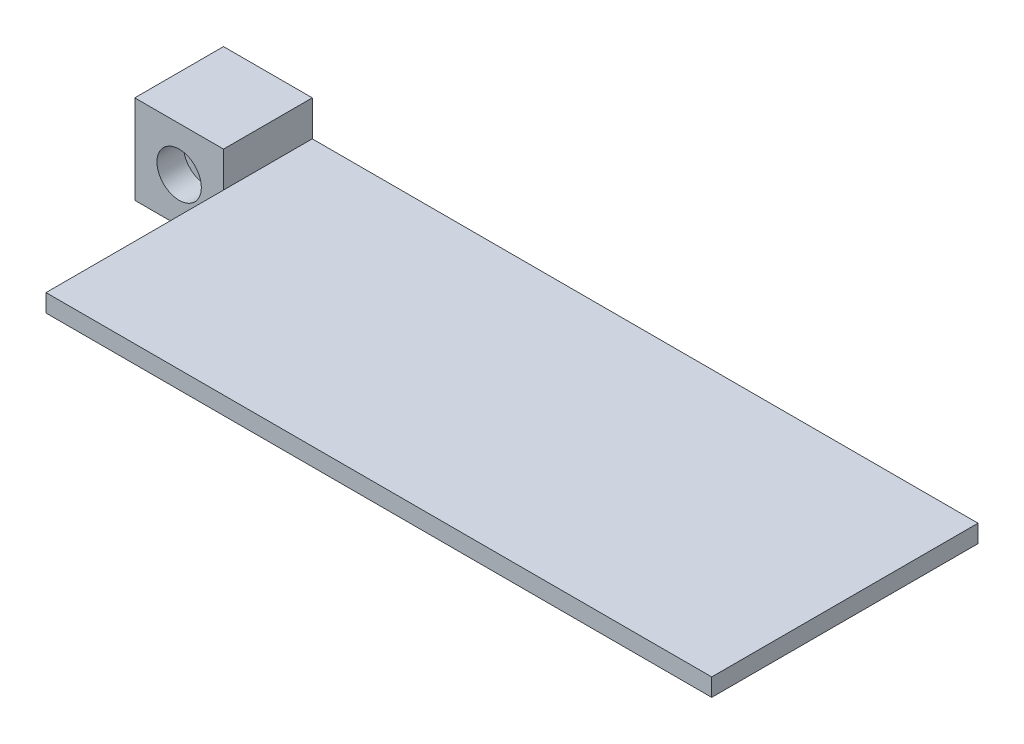
ISO-10303-21;
HEADER;
FILE_DESCRIPTION(('STEP AP214'),'2;1');
FILE_NAME('part.step','',(''),(''),'','','');
FILE_SCHEMA(('AUTOMOTIVE_DESIGN { 1 0 10303 214 1 1 1 1 }'));
ENDSEC;
DATA;
#1=APPLICATION_CONTEXT('core data for automotive mechanical design processes');
#2=APPLICATION_PROTOCOL_DEFINITION('international standard','automotive_design',2000,#1);
#3=PRODUCT_CONTEXT('',#1,'mechanical');
#4=PRODUCT('Part','Part','',(#3));
#5=PRODUCT_RELATED_PRODUCT_CATEGORY('part','',(#4));
#6=PRODUCT_DEFINITION_FORMATION('','',#4);
#7=PRODUCT_DEFINITION_CONTEXT('part definition',#1,'design');
#8=PRODUCT_DEFINITION('design','',#6,#7);
#9=PRODUCT_DEFINITION_SHAPE('','',#8);
#10=(LENGTH_UNIT() NAMED_UNIT(*) SI_UNIT(.MILLI.,.METRE.));
#11=(NAMED_UNIT(*) PLANE_ANGLE_UNIT() SI_UNIT($,.RADIAN.));
#12=(NAMED_UNIT(*) SI_UNIT($,.STERADIAN.) SOLID_ANGLE_UNIT());
#13=UNCERTAINTY_MEASURE_WITH_UNIT(LENGTH_MEASURE(1.E-05),#10,'distance_accuracy_value','');
#14=(GEOMETRIC_REPRESENTATION_CONTEXT(3) GLOBAL_UNCERTAINTY_ASSIGNED_CONTEXT((#13)) GLOBAL_UNIT_ASSIGNED_CONTEXT((#10,
#11,#12)) REPRESENTATION_CONTEXT('',''));
#15=CARTESIAN_POINT('',(0.,0.,0.));
#16=DIRECTION('',(0.,0.,1.));
#17=DIRECTION('',(1.,0.,0.));
#18=AXIS2_PLACEMENT_3D('',#15,#16,#17);
#19=CARTESIAN_POINT('',(-42.5,15.,30.));
#20=DIRECTION('',(1.,0.,0.));
#21=DIRECTION('',(0.,1.,0.));
#22=AXIS2_PLACEMENT_3D('',#19,#20,#21);
#23=PLANE('',#22);
#24=DIRECTION('',(0.,-1.,0.));
#25=VECTOR('',#24,1.);
#26=CARTESIAN_POINT('',(-42.5,0.,10.));
#27=LINE('',#26,#25);
#28=CARTESIAN_POINT('',(-42.5,0.,10.));
#29=VERTEX_POINT('',#28);
#30=CARTESIAN_POINT('',(-42.5,-10.,10.));
#31=VERTEX_POINT('',#30);
#32=EDGE_CURVE('E107',#29,#31,#27,.T.);
#33=ORIENTED_EDGE('',*,*,#32,.F.);
#34=DIRECTION('',(0.,0.,1.));
#35=VECTOR('',#34,1.);
#36=CARTESIAN_POINT('',(-42.5,0.,0.));
#37=LINE('',#36,#35);
#38=CARTESIAN_POINT('',(-42.5,0.,0.));
#39=VERTEX_POINT('',#38);
#40=EDGE_CURVE('E161',#39,#29,#37,.T.);
#41=ORIENTED_EDGE('',*,*,#40,.F.);
#42=DIRECTION('',(0.,-1.,0.));
#43=VECTOR('',#42,1.);
#44=CARTESIAN_POINT('',(-42.5,15.,0.));
#45=LINE('',#44,#43);
#46=CARTESIAN_POINT('',(-42.5,-10.,0.));
#47=VERTEX_POINT('',#46);
#48=EDGE_CURVE('E43',#39,#47,#45,.T.);
#49=ORIENTED_EDGE('',*,*,#48,.T.);
#50=DIRECTION('',(0.,0.,1.));
#51=VECTOR('',#50,1.);
#52=CARTESIAN_POINT('',(-42.5,-10.,0.));
#53=LINE('',#52,#51);
#54=EDGE_CURVE('E124',#47,#31,#53,.T.);
#55=ORIENTED_EDGE('',*,*,#54,.T.);
#56=EDGE_LOOP('',(#33,#41,#49,#55));
#57=FACE_BOUND('',#56,.T.);
#58=ADVANCED_FACE('F34',(#57),#23,.F.);
#59=CARTESIAN_POINT('',(-42.5,-10.,0.));
#60=DIRECTION('',(0.,1.,0.));
#61=DIRECTION('',(0.,0.,1.));
#62=AXIS2_PLACEMENT_3D('',#59,#60,#61);
#63=PLANE('',#62);
#64=DIRECTION('',(1.,0.,0.));
#65=VECTOR('',#64,1.);
#66=CARTESIAN_POINT('',(-42.5,-10.,10.));
#67=LINE('',#66,#65);
#68=CARTESIAN_POINT('',(-32.5,-10.,10.));
#69=VERTEX_POINT('',#68);
#70=EDGE_CURVE('E111',#31,#69,#67,.T.);
#71=ORIENTED_EDGE('',*,*,#70,.F.);
#72=ORIENTED_EDGE('',*,*,#54,.F.);
#73=DIRECTION('',(-1.,0.,0.));
#74=VECTOR('',#73,1.);
#75=CARTESIAN_POINT('',(-42.5,-10.,0.));
#76=LINE('',#75,#74);
#77=CARTESIAN_POINT('',(-32.5,-10.,0.));
#78=VERTEX_POINT('',#77);
#79=EDGE_CURVE('E143',#78,#47,#76,.T.);
#80=ORIENTED_EDGE('',*,*,#79,.F.);
#81=DIRECTION('',(0.,0.,1.));
#82=VECTOR('',#81,1.);
#83=CARTESIAN_POINT('',(-32.5,-10.,0.));
#84=LINE('',#83,#82);
#85=EDGE_CURVE('E126',#78,#69,#84,.T.);
#86=ORIENTED_EDGE('',*,*,#85,.T.);
#87=EDGE_LOOP('',(#71,#72,#80,#86));
#88=FACE_BOUND('',#87,.T.);
#89=ADVANCED_FACE('F122',(#88),#63,.F.);
#90=CARTESIAN_POINT('',(-32.5,-10.,0.));
#91=DIRECTION('',(-1.,0.,0.));
#92=DIRECTION('',(0.,0.,1.));
#93=AXIS2_PLACEMENT_3D('',#90,#91,#92);
#94=PLANE('',#93);
#95=DIRECTION('',(0.,1.,0.));
#96=VECTOR('',#95,1.);
#97=CARTESIAN_POINT('',(-32.5,0.,10.));
#98=LINE('',#97,#96);
#99=CARTESIAN_POINT('',(-32.5,-6.,10.));
#100=VERTEX_POINT('',#99);
#101=EDGE_CURVE('E271',#69,#100,#98,.T.);
#102=ORIENTED_EDGE('',*,*,#101,.F.);
#103=ORIENTED_EDGE('',*,*,#85,.F.);
#104=DIRECTION('',(0.,-1.,0.));
#105=VECTOR('',#104,1.);
#106=CARTESIAN_POINT('',(-32.5,-10.,0.));
#107=LINE('',#106,#105);
#108=CARTESIAN_POINT('',(-32.5,-6.,0.));
#109=VERTEX_POINT('',#108);
#110=EDGE_CURVE('E167',#109,#78,#107,.T.);
#111=ORIENTED_EDGE('',*,*,#110,.F.);
#112=DIRECTION('',(0.,0.,1.));
#113=VECTOR('',#112,1.);
#114=CARTESIAN_POINT('',(-32.5,-6.,0.));
#115=LINE('',#114,#113);
#116=EDGE_CURVE('E134',#109,#100,#115,.T.);
#117=ORIENTED_EDGE('',*,*,#116,.T.);
#118=EDGE_LOOP('',(#102,#103,#111,#117));
#119=FACE_BOUND('',#118,.T.);
#120=ADVANCED_FACE('F174',(#119),#94,.F.);
#121=CARTESIAN_POINT('',(-32.5,0.,0.));
#122=DIRECTION('',(-1.,0.,0.));
#123=DIRECTION('',(0.,0.,1.));
#124=AXIS2_PLACEMENT_3D('',#121,#122,#123);
#125=PLANE('',#124);
#126=CARTESIAN_POINT('',(-32.5,-4.,10.));
#127=VERTEX_POINT('',#126);
#128=CARTESIAN_POINT('',(-32.5,0.,10.));
#129=VERTEX_POINT('',#128);
#130=EDGE_CURVE('E51',#127,#129,#98,.T.);
#131=ORIENTED_EDGE('',*,*,#130,.F.);
#132=DIRECTION('',(0.,0.,1.));
#133=VECTOR('',#132,1.);
#134=CARTESIAN_POINT('',(-32.5,-4.,0.));
#135=LINE('',#134,#133);
#136=CARTESIAN_POINT('',(-32.5,-4.,0.));
#137=VERTEX_POINT('',#136);
#138=EDGE_CURVE('E152',#137,#127,#135,.T.);
#139=ORIENTED_EDGE('',*,*,#138,.F.);
#140=DIRECTION('',(0.,-1.,0.));
#141=VECTOR('',#140,1.);
#142=CARTESIAN_POINT('',(-32.5,0.,0.));
#143=LINE('',#142,#141);
#144=CARTESIAN_POINT('',(-32.5,0.,0.));
#145=VERTEX_POINT('',#144);
#146=EDGE_CURVE('E59',#145,#137,#143,.T.);
#147=ORIENTED_EDGE('',*,*,#146,.F.);
#148=DIRECTION('',(0.,0.,1.));
#149=VECTOR('',#148,1.);
#150=CARTESIAN_POINT('',(-32.5,0.,0.));
#151=LINE('',#150,#149);
#152=EDGE_CURVE('E156',#145,#129,#151,.T.);
#153=ORIENTED_EDGE('',*,*,#152,.T.);
#154=EDGE_LOOP('',(#131,#139,#147,#153));
#155=FACE_BOUND('',#154,.T.);
#156=ADVANCED_FACE('F204',(#155),#125,.F.);
#157=CARTESIAN_POINT('',(-42.5,0.,0.));
#158=DIRECTION('',(0.,-1.,0.));
#159=DIRECTION('',(0.,0.,-1.));
#160=AXIS2_PLACEMENT_3D('',#157,#158,#159);
#161=PLANE('',#160);
#162=DIRECTION('',(-1.,0.,0.));
#163=VECTOR('',#162,1.);
#164=CARTESIAN_POINT('',(-42.5,0.,10.));
#165=LINE('',#164,#163);
#166=EDGE_CURVE('E113',#129,#29,#165,.T.);
#167=ORIENTED_EDGE('',*,*,#166,.F.);
#168=ORIENTED_EDGE('',*,*,#152,.F.);
#169=DIRECTION('',(1.,0.,0.));
#170=VECTOR('',#169,1.);
#171=CARTESIAN_POINT('',(-42.5,0.,0.));
#172=LINE('',#171,#170);
#173=EDGE_CURVE('E132',#39,#145,#172,.T.);
#174=ORIENTED_EDGE('',*,*,#173,.F.);
#175=ORIENTED_EDGE('',*,*,#40,.T.);
#176=EDGE_LOOP('',(#167,#168,#174,#175));
#177=FACE_BOUND('',#176,.T.);
#178=ADVANCED_FACE('F198',(#177),#161,.F.);
#179=CARTESIAN_POINT('',(42.5,15.,30.));
#180=DIRECTION('',(-1.,0.,0.));
#181=DIRECTION('',(0.,-1.,0.));
#182=AXIS2_PLACEMENT_3D('',#179,#180,#181);
#183=PLANE('',#182);
#184=DIRECTION('',(0.,1.,0.));
#185=VECTOR('',#184,1.);
#186=CARTESIAN_POINT('',(42.5,15.,0.));
#187=LINE('',#186,#185);
#188=CARTESIAN_POINT('',(42.5,-6.,0.));
#189=VERTEX_POINT('',#188);
#190=CARTESIAN_POINT('',(42.5,-4.,0.));
#191=VERTEX_POINT('',#190);
#192=EDGE_CURVE('E145',#189,#191,#187,.T.);
#193=ORIENTED_EDGE('',*,*,#192,.T.);
#194=DIRECTION('',(0.,0.,1.));
#195=VECTOR('',#194,1.);
#196=CARTESIAN_POINT('',(42.5,-4.,0.));
#197=LINE('',#196,#195);
#198=CARTESIAN_POINT('',(42.5,-4.,30.));
#199=VERTEX_POINT('',#198);
#200=EDGE_CURVE('E147',#191,#199,#197,.T.);
#201=ORIENTED_EDGE('',*,*,#200,.T.);
#202=DIRECTION('',(0.,1.,0.));
#203=VECTOR('',#202,1.);
#204=CARTESIAN_POINT('',(42.5,15.,30.));
#205=LINE('',#204,#203);
#206=CARTESIAN_POINT('',(42.5,-6.,30.));
#207=VERTEX_POINT('',#206);
#208=EDGE_CURVE('E11',#207,#199,#205,.T.);
#209=ORIENTED_EDGE('',*,*,#208,.F.);
#210=DIRECTION('',(0.,0.,1.));
#211=VECTOR('',#210,1.);
#212=CARTESIAN_POINT('',(42.5,-6.,0.));
#213=LINE('',#212,#211);
#214=EDGE_CURVE('E142',#189,#207,#213,.T.);
#215=ORIENTED_EDGE('',*,*,#214,.F.);
#216=EDGE_LOOP('',(#193,#201,#209,#215));
#217=FACE_BOUND('',#216,.T.);
#218=ADVANCED_FACE('F36',(#217),#183,.F.);
#219=CARTESIAN_POINT('',(0.,0.,30.));
#220=DIRECTION('',(0.,0.,1.));
#221=DIRECTION('',(1.,0.,0.));
#222=AXIS2_PLACEMENT_3D('',#219,#220,#221);
#223=PLANE('',#222);
#224=DIRECTION('',(0.,1.,0.));
#225=VECTOR('',#224,1.);
#226=CARTESIAN_POINT('',(-32.5,0.,30.));
#227=LINE('',#226,#225);
#228=CARTESIAN_POINT('',(-32.5,-6.,30.));
#229=VERTEX_POINT('',#228);
#230=CARTESIAN_POINT('',(-32.5,-4.,30.));
#231=VERTEX_POINT('',#230);
#232=EDGE_CURVE('E118',#229,#231,#227,.T.);
#233=ORIENTED_EDGE('',*,*,#232,.F.);
#234=DIRECTION('',(-1.,0.,0.));
#235=VECTOR('',#234,1.);
#236=CARTESIAN_POINT('',(-32.5,-6.,30.));
#237=LINE('',#236,#235);
#238=EDGE_CURVE('E137',#207,#229,#237,.T.);
#239=ORIENTED_EDGE('',*,*,#238,.F.);
#240=ORIENTED_EDGE('',*,*,#208,.T.);
#241=DIRECTION('',(1.,0.,0.));
#242=VECTOR('',#241,1.);
#243=CARTESIAN_POINT('',(-32.5,-4.,30.));
#244=LINE('',#243,#242);
#245=EDGE_CURVE('E130',#231,#199,#244,.T.);
#246=ORIENTED_EDGE('',*,*,#245,.F.);
#247=EDGE_LOOP('',(#233,#239,#240,#246));
#248=FACE_BOUND('',#247,.T.);
#249=ADVANCED_FACE('F196',(#248),#223,.T.);
#250=CARTESIAN_POINT('',(0.,0.,0.));
#251=DIRECTION('',(0.,0.,1.));
#252=DIRECTION('',(1.,0.,0.));
#253=AXIS2_PLACEMENT_3D('',#250,#251,#252);
#254=PLANE('',#253);
#255=CARTESIAN_POINT('',(-37.5,-5.,0.));
#256=DIRECTION('',(0.,0.,-1.));
#257=DIRECTION('',(-1.,0.,0.));
#258=AXIS2_PLACEMENT_3D('',#255,#256,#257);
#259=CIRCLE('',#258,2.5);
#260=CARTESIAN_POINT('',(-40.,-5.,0.));
#261=VERTEX_POINT('',#260);
#262=EDGE_CURVE('E263',#261,#261,#259,.T.);
#263=ORIENTED_EDGE('',*,*,#262,.F.);
#264=EDGE_LOOP('',(#263));
#265=FACE_BOUND('',#264,.T.);
#266=ORIENTED_EDGE('',*,*,#146,.T.);
#267=DIRECTION('',(1.,0.,0.));
#268=VECTOR('',#267,1.);
#269=CARTESIAN_POINT('',(-32.5,-4.,0.));
#270=LINE('',#269,#268);
#271=EDGE_CURVE('E163',#137,#191,#270,.T.);
#272=ORIENTED_EDGE('',*,*,#271,.T.);
#273=ORIENTED_EDGE('',*,*,#192,.F.);
#274=DIRECTION('',(-1.,0.,0.));
#275=VECTOR('',#274,1.);
#276=CARTESIAN_POINT('',(-32.5,-6.,0.));
#277=LINE('',#276,#275);
#278=EDGE_CURVE('E164',#189,#109,#277,.T.);
#279=ORIENTED_EDGE('',*,*,#278,.T.);
#280=ORIENTED_EDGE('',*,*,#110,.T.);
#281=ORIENTED_EDGE('',*,*,#79,.T.);
#282=ORIENTED_EDGE('',*,*,#48,.F.);
#283=ORIENTED_EDGE('',*,*,#173,.T.);
#284=EDGE_LOOP('',(#266,#272,#273,#279,#280,#281,#282,#283));
#285=FACE_BOUND('',#284,.T.);
#286=ADVANCED_FACE('F170',(#265,#285),#254,.F.);
#287=CARTESIAN_POINT('',(-32.5,-6.,0.));
#288=DIRECTION('',(0.,1.,0.));
#289=DIRECTION('',(0.,0.,1.));
#290=AXIS2_PLACEMENT_3D('',#287,#288,#289);
#291=PLANE('',#290);
#292=ORIENTED_EDGE('',*,*,#238,.T.);
#293=DIRECTION('',(0.,0.,-1.));
#294=VECTOR('',#293,1.);
#295=CARTESIAN_POINT('',(-32.5,-6.,0.));
#296=LINE('',#295,#294);
#297=EDGE_CURVE('E179',#229,#100,#296,.T.);
#298=ORIENTED_EDGE('',*,*,#297,.T.);
#299=ORIENTED_EDGE('',*,*,#116,.F.);
#300=ORIENTED_EDGE('',*,*,#278,.F.);
#301=ORIENTED_EDGE('',*,*,#214,.T.);
#302=EDGE_LOOP('',(#292,#298,#299,#300,#301));
#303=FACE_BOUND('',#302,.T.);
#304=ADVANCED_FACE('F178',(#303),#291,.F.);
#305=CARTESIAN_POINT('',(-32.5,-4.,0.));
#306=DIRECTION('',(0.,-1.,0.));
#307=DIRECTION('',(0.,0.,-1.));
#308=AXIS2_PLACEMENT_3D('',#305,#306,#307);
#309=PLANE('',#308);
#310=ORIENTED_EDGE('',*,*,#245,.T.);
#311=ORIENTED_EDGE('',*,*,#200,.F.);
#312=ORIENTED_EDGE('',*,*,#271,.F.);
#313=ORIENTED_EDGE('',*,*,#138,.T.);
#314=DIRECTION('',(0.,0.,1.));
#315=VECTOR('',#314,1.);
#316=CARTESIAN_POINT('',(-32.5,-4.,0.));
#317=LINE('',#316,#315);
#318=EDGE_CURVE('E183',#127,#231,#317,.T.);
#319=ORIENTED_EDGE('',*,*,#318,.T.);
#320=EDGE_LOOP('',(#310,#311,#312,#313,#319));
#321=FACE_BOUND('',#320,.T.);
#322=ADVANCED_FACE('F193',(#321),#309,.F.);
#323=CARTESIAN_POINT('',(-32.5,0.,10.));
#324=DIRECTION('',(1.,0.,0.));
#325=DIRECTION('',(0.,0.,-1.));
#326=AXIS2_PLACEMENT_3D('',#323,#324,#325);
#327=PLANE('',#326);
#328=ORIENTED_EDGE('',*,*,#232,.T.);
#329=ORIENTED_EDGE('',*,*,#318,.F.);
#330=EDGE_CURVE('E273',#100,#127,#98,.T.);
#331=ORIENTED_EDGE('',*,*,#330,.F.);
#332=ORIENTED_EDGE('',*,*,#297,.F.);
#333=EDGE_LOOP('',(#328,#329,#331,#332));
#334=FACE_BOUND('',#333,.T.);
#335=ADVANCED_FACE('F224',(#334),#327,.F.);
#336=CARTESIAN_POINT('',(0.,0.,10.));
#337=DIRECTION('',(0.,0.,1.));
#338=DIRECTION('',(1.,0.,0.));
#339=AXIS2_PLACEMENT_3D('',#336,#337,#338);
#340=PLANE('',#339);
#341=CARTESIAN_POINT('',(-37.5,-5.,10.));
#342=DIRECTION('',(0.,0.,1.));
#343=DIRECTION('',(1.,0.,0.));
#344=AXIS2_PLACEMENT_3D('',#341,#342,#343);
#345=CIRCLE('',#344,2.5);
#346=CARTESIAN_POINT('',(-35.,-5.,10.));
#347=VERTEX_POINT('',#346);
#348=EDGE_CURVE('E258',#347,#347,#345,.T.);
#349=ORIENTED_EDGE('',*,*,#348,.F.);
#350=EDGE_LOOP('',(#349));
#351=FACE_BOUND('',#350,.T.);
#352=ORIENTED_EDGE('',*,*,#32,.T.);
#353=ORIENTED_EDGE('',*,*,#70,.T.);
#354=ORIENTED_EDGE('',*,*,#101,.T.);
#355=ORIENTED_EDGE('',*,*,#330,.T.);
#356=ORIENTED_EDGE('',*,*,#130,.T.);
#357=ORIENTED_EDGE('',*,*,#166,.T.);
#358=EDGE_LOOP('',(#352,#353,#354,#355,#356,#357));
#359=FACE_BOUND('',#358,.T.);
#360=ADVANCED_FACE('F109',(#351,#359),#340,.T.);
#361=CARTESIAN_POINT('',(-37.5,-5.,4.));
#362=DIRECTION('',(0.,0.,-1.));
#363=DIRECTION('',(-1.,0.,0.));
#364=AXIS2_PLACEMENT_3D('',#361,#362,#363);
#365=CYLINDRICAL_SURFACE('',#364,2.5);
#366=CARTESIAN_POINT('',(-37.5,-5.,4.));
#367=DIRECTION('',(0.,0.,-1.));
#368=DIRECTION('',(-1.,0.,0.));
#369=AXIS2_PLACEMENT_3D('',#366,#367,#368);
#370=CIRCLE('',#369,2.5);
#371=CARTESIAN_POINT('',(-40.,-5.,4.));
#372=VERTEX_POINT('',#371);
#373=EDGE_CURVE('E266',#372,#372,#370,.T.);
#374=ORIENTED_EDGE('',*,*,#373,.F.);
#375=EDGE_LOOP('',(#374));
#376=FACE_BOUND('',#375,.T.);
#377=ORIENTED_EDGE('',*,*,#262,.T.);
#378=EDGE_LOOP('',(#377));
#379=FACE_BOUND('',#378,.T.);
#380=ADVANCED_FACE('F229',(#376,#379),#365,.F.);
#381=CARTESIAN_POINT('',(-37.5,-5.,4.));
#382=DIRECTION('',(0.,0.,-1.));
#383=DIRECTION('',(-1.,0.,0.));
#384=AXIS2_PLACEMENT_3D('',#381,#382,#383);
#385=PLANE('',#384);
#386=CARTESIAN_POINT('',(-37.5,-5.,4.));
#387=DIRECTION('',(0.,0.,-1.));
#388=DIRECTION('',(-1.,0.,0.));
#389=AXIS2_PLACEMENT_3D('',#386,#387,#388);
#390=CIRCLE('',#389,0.999999999999998);
#391=CARTESIAN_POINT('',(-38.5,-5.,4.));
#392=VERTEX_POINT('',#391);
#393=EDGE_CURVE('E38',#392,#392,#390,.T.);
#394=ORIENTED_EDGE('',*,*,#393,.F.);
#395=EDGE_LOOP('',(#394));
#396=FACE_BOUND('',#395,.T.);
#397=ORIENTED_EDGE('',*,*,#373,.T.);
#398=EDGE_LOOP('',(#397));
#399=FACE_BOUND('',#398,.T.);
#400=ADVANCED_FACE('F233',(#396,#399),#385,.T.);
#401=CARTESIAN_POINT('',(-37.5,-5.,7.));
#402=DIRECTION('',(0.,0.,1.));
#403=DIRECTION('',(1.,0.,0.));
#404=AXIS2_PLACEMENT_3D('',#401,#402,#403);
#405=CYLINDRICAL_SURFACE('',#404,2.5);
#406=CARTESIAN_POINT('',(-37.5,-5.,7.));
#407=DIRECTION('',(0.,0.,1.));
#408=DIRECTION('',(1.,0.,0.));
#409=AXIS2_PLACEMENT_3D('',#406,#407,#408);
#410=CIRCLE('',#409,2.5);
#411=CARTESIAN_POINT('',(-35.,-5.,7.));
#412=VERTEX_POINT('',#411);
#413=EDGE_CURVE('E260',#412,#412,#410,.T.);
#414=ORIENTED_EDGE('',*,*,#413,.F.);
#415=EDGE_LOOP('',(#414));
#416=FACE_BOUND('',#415,.T.);
#417=ORIENTED_EDGE('',*,*,#348,.T.);
#418=EDGE_LOOP('',(#417));
#419=FACE_BOUND('',#418,.T.);
#420=ADVANCED_FACE('F237',(#416,#419),#405,.F.);
#421=CARTESIAN_POINT('',(-37.5,-5.,7.));
#422=DIRECTION('',(0.,0.,1.));
#423=DIRECTION('',(1.,0.,0.));
#424=AXIS2_PLACEMENT_3D('',#421,#422,#423);
#425=PLANE('',#424);
#426=CARTESIAN_POINT('',(-37.5,-5.,7.));
#427=DIRECTION('',(0.,0.,1.));
#428=DIRECTION('',(1.,0.,0.));
#429=AXIS2_PLACEMENT_3D('',#426,#427,#428);
#430=CIRCLE('',#429,0.999999999999998);
#431=CARTESIAN_POINT('',(-36.5,-5.,7.));
#432=VERTEX_POINT('',#431);
#433=EDGE_CURVE('E256',#432,#432,#430,.T.);
#434=ORIENTED_EDGE('',*,*,#433,.F.);
#435=EDGE_LOOP('',(#434));
#436=FACE_BOUND('',#435,.T.);
#437=ORIENTED_EDGE('',*,*,#413,.T.);
#438=EDGE_LOOP('',(#437));
#439=FACE_BOUND('',#438,.T.);
#440=ADVANCED_FACE('F241',(#436,#439),#425,.T.);
#441=CARTESIAN_POINT('',(-37.5,-5.,0.));
#442=DIRECTION('',(0.,0.,1.));
#443=DIRECTION('',(1.,0.,0.));
#444=AXIS2_PLACEMENT_3D('',#441,#442,#443);
#445=CYLINDRICAL_SURFACE('',#444,0.999999999999998);
#446=ORIENTED_EDGE('',*,*,#393,.T.);
#447=EDGE_LOOP('',(#446));
#448=FACE_BOUND('',#447,.T.);
#449=ORIENTED_EDGE('',*,*,#433,.T.);
#450=EDGE_LOOP('',(#449));
#451=FACE_BOUND('',#450,.T.);
#452=ADVANCED_FACE('F245',(#448,#451),#445,.F.);
#453=CLOSED_SHELL('',(#58,#89,#120,#156,#178,#218,#249,#286,#304,#322,#335,#360,#380,#400,#420,
#440,#452));
#454=MANIFOLD_SOLID_BREP('B2',#453);
#455=ADVANCED_BREP_SHAPE_REPRESENTATION('',(#18,#454),#14);
#456=SHAPE_DEFINITION_REPRESENTATION(#9,#455);
ENDSEC;
END-ISO-10303-21;
